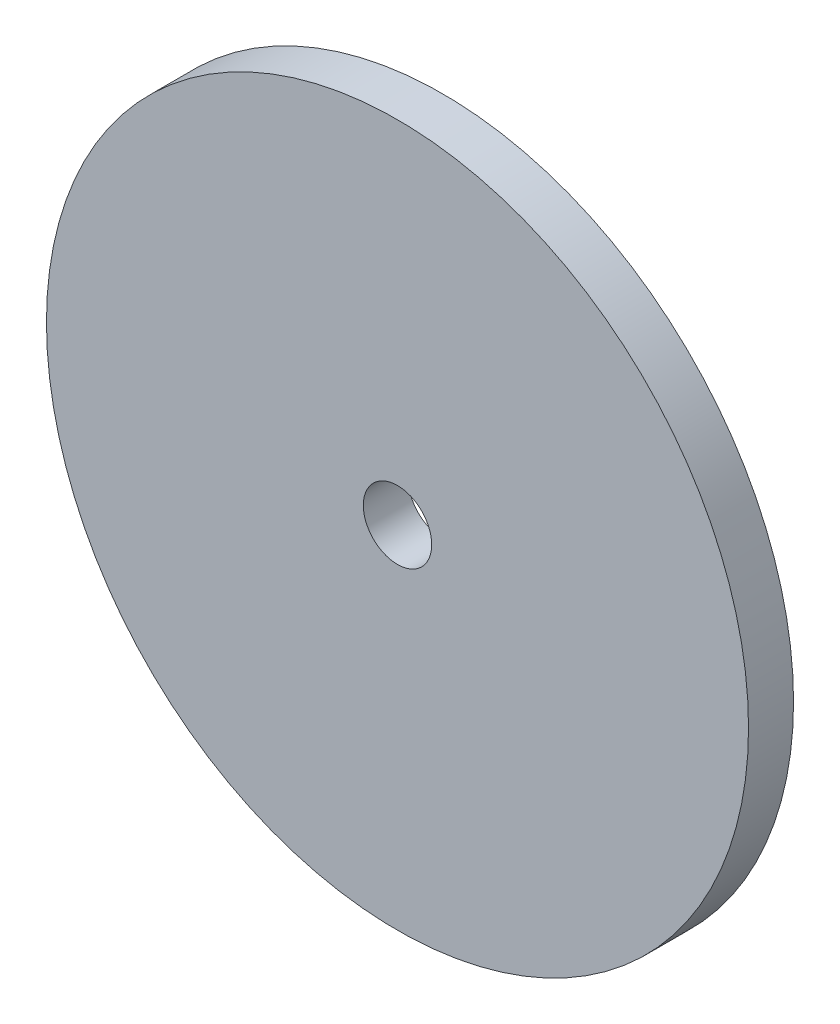
ISO-10303-21;
HEADER;
FILE_DESCRIPTION(('STEP AP214'),'2;1');
FILE_NAME('part.step','',(''),(''),'','','');
FILE_SCHEMA(('AUTOMOTIVE_DESIGN { 1 0 10303 214 1 1 1 1 }'));
ENDSEC;
DATA;
#1=APPLICATION_CONTEXT('core data for automotive mechanical design processes');
#2=APPLICATION_PROTOCOL_DEFINITION('international standard','automotive_design',2000,#1);
#3=PRODUCT_CONTEXT('',#1,'mechanical');
#4=PRODUCT('Part','Part','',(#3));
#5=PRODUCT_RELATED_PRODUCT_CATEGORY('part','',(#4));
#6=PRODUCT_DEFINITION_FORMATION('','',#4);
#7=PRODUCT_DEFINITION_CONTEXT('part definition',#1,'design');
#8=PRODUCT_DEFINITION('design','',#6,#7);
#9=PRODUCT_DEFINITION_SHAPE('','',#8);
#10=(LENGTH_UNIT() NAMED_UNIT(*) SI_UNIT(.MILLI.,.METRE.));
#11=(NAMED_UNIT(*) PLANE_ANGLE_UNIT() SI_UNIT($,.RADIAN.));
#12=(NAMED_UNIT(*) SI_UNIT($,.STERADIAN.) SOLID_ANGLE_UNIT());
#13=UNCERTAINTY_MEASURE_WITH_UNIT(LENGTH_MEASURE(1.E-05),#10,'distance_accuracy_value','');
#14=(GEOMETRIC_REPRESENTATION_CONTEXT(3) GLOBAL_UNCERTAINTY_ASSIGNED_CONTEXT((#13)) GLOBAL_UNIT_ASSIGNED_CONTEXT((#10,
#11,#12)) REPRESENTATION_CONTEXT('',''));
#15=CARTESIAN_POINT('',(0.,0.,0.));
#16=DIRECTION('',(0.,0.,1.));
#17=DIRECTION('',(1.,0.,0.));
#18=AXIS2_PLACEMENT_3D('',#15,#16,#17);
#19=CARTESIAN_POINT('',(0.,0.,6.35));
#20=DIRECTION('',(0.,0.,-1.));
#21=DIRECTION('',(-1.,0.,0.));
#22=AXIS2_PLACEMENT_3D('',#19,#20,#21);
#23=CYLINDRICAL_SURFACE('',#22,49.53);
#24=CARTESIAN_POINT('',(0.,0.,6.35));
#25=DIRECTION('',(0.,0.,1.));
#26=DIRECTION('',(1.,0.,0.));
#27=AXIS2_PLACEMENT_3D('',#24,#25,#26);
#28=CIRCLE('',#27,49.53);
#29=CARTESIAN_POINT('',(49.53,0.,6.35));
#30=VERTEX_POINT('',#29);
#31=EDGE_CURVE('E12',#30,#30,#28,.T.);
#32=ORIENTED_EDGE('',*,*,#31,.F.);
#33=EDGE_LOOP('',(#32));
#34=FACE_BOUND('',#33,.T.);
#35=CARTESIAN_POINT('',(0.,0.,0.));
#36=DIRECTION('',(0.,0.,1.));
#37=DIRECTION('',(1.,0.,0.));
#38=AXIS2_PLACEMENT_3D('',#35,#36,#37);
#39=CIRCLE('',#38,49.53);
#40=CARTESIAN_POINT('',(49.53,0.,0.));
#41=VERTEX_POINT('',#40);
#42=EDGE_CURVE('E48',#41,#41,#39,.T.);
#43=ORIENTED_EDGE('',*,*,#42,.T.);
#44=EDGE_LOOP('',(#43));
#45=FACE_BOUND('',#44,.T.);
#46=ADVANCED_FACE('F45',(#34,#45),#23,.T.);
#47=CARTESIAN_POINT('',(0.,0.,6.35));
#48=DIRECTION('',(0.,0.,1.));
#49=DIRECTION('',(1.,0.,0.));
#50=AXIS2_PLACEMENT_3D('',#47,#48,#49);
#51=PLANE('',#50);
#52=CARTESIAN_POINT('',(0.,0.,6.35));
#53=DIRECTION('',(0.,0.,-1.));
#54=DIRECTION('',(-1.,0.,0.));
#55=AXIS2_PLACEMENT_3D('',#52,#53,#54);
#56=CIRCLE('',#55,4.826);
#57=CARTESIAN_POINT('',(-4.826,0.,6.35));
#58=VERTEX_POINT('',#57);
#59=EDGE_CURVE('E55',#58,#58,#56,.T.);
#60=ORIENTED_EDGE('',*,*,#59,.T.);
#61=EDGE_LOOP('',(#60));
#62=FACE_BOUND('',#61,.T.);
#63=ORIENTED_EDGE('',*,*,#31,.T.);
#64=EDGE_LOOP('',(#63));
#65=FACE_BOUND('',#64,.T.);
#66=ADVANCED_FACE('F63',(#62,#65),#51,.T.);
#67=CARTESIAN_POINT('',(0.,0.,0.));
#68=DIRECTION('',(0.,0.,1.));
#69=DIRECTION('',(1.,0.,0.));
#70=AXIS2_PLACEMENT_3D('',#67,#68,#69);
#71=PLANE('',#70);
#72=CARTESIAN_POINT('',(0.,0.,0.));
#73=DIRECTION('',(0.,0.,-1.));
#74=DIRECTION('',(-1.,0.,0.));
#75=AXIS2_PLACEMENT_3D('',#72,#73,#74);
#76=CIRCLE('',#75,4.826);
#77=CARTESIAN_POINT('',(-4.826,0.,0.));
#78=VERTEX_POINT('',#77);
#79=EDGE_CURVE('E57',#78,#78,#76,.T.);
#80=ORIENTED_EDGE('',*,*,#79,.F.);
#81=EDGE_LOOP('',(#80));
#82=FACE_BOUND('',#81,.T.);
#83=ORIENTED_EDGE('',*,*,#42,.F.);
#84=EDGE_LOOP('',(#83));
#85=FACE_BOUND('',#84,.T.);
#86=ADVANCED_FACE('F68',(#82,#85),#71,.F.);
#87=CARTESIAN_POINT('',(0.,0.,6.35));
#88=DIRECTION('',(0.,0.,-1.));
#89=DIRECTION('',(-1.,0.,0.));
#90=AXIS2_PLACEMENT_3D('',#87,#88,#89);
#91=CYLINDRICAL_SURFACE('',#90,4.826);
#92=ORIENTED_EDGE('',*,*,#59,.F.);
#93=EDGE_LOOP('',(#92));
#94=FACE_BOUND('',#93,.T.);
#95=ORIENTED_EDGE('',*,*,#79,.T.);
#96=EDGE_LOOP('',(#95));
#97=FACE_BOUND('',#96,.T.);
#98=ADVANCED_FACE('F65',(#94,#97),#91,.F.);
#99=CLOSED_SHELL('',(#46,#66,#86,#98));
#100=MANIFOLD_SOLID_BREP('B2',#99);
#101=ADVANCED_BREP_SHAPE_REPRESENTATION('',(#18,#100),#14);
#102=SHAPE_DEFINITION_REPRESENTATION(#9,#101);
ENDSEC;
END-ISO-10303-21;
